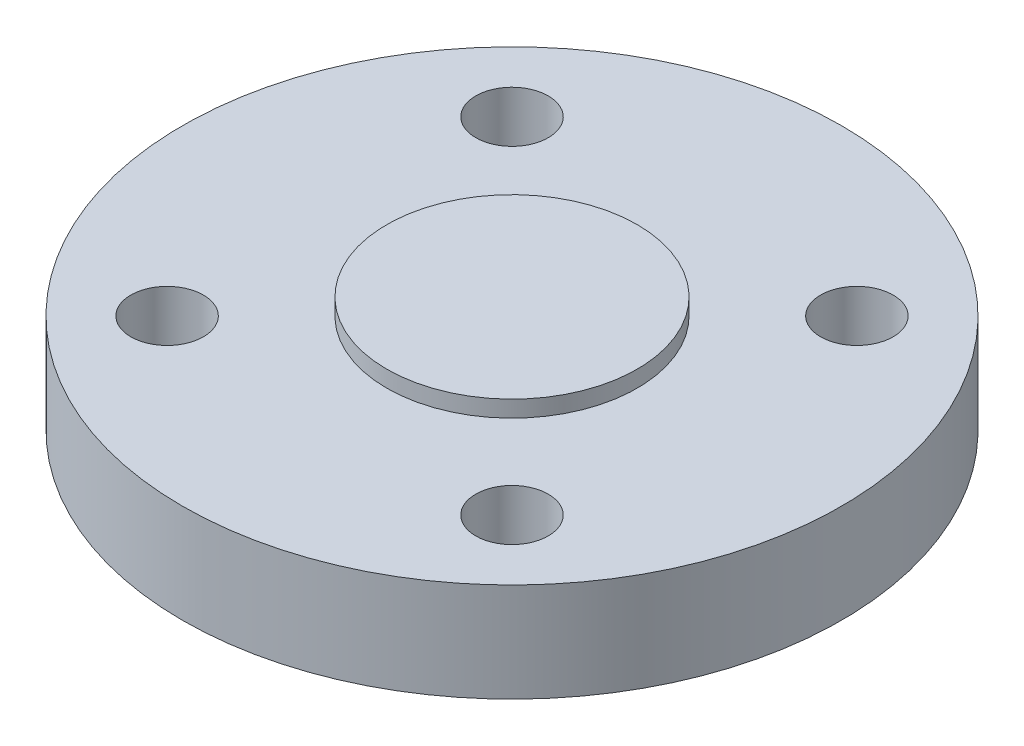
ISO-10303-21;
HEADER;
FILE_DESCRIPTION(('STEP AP214'),'2;1');
FILE_NAME('part.step','',(''),(''),'','','');
FILE_SCHEMA(('AUTOMOTIVE_DESIGN { 1 0 10303 214 1 1 1 1 }'));
ENDSEC;
DATA;
#1=APPLICATION_CONTEXT('core data for automotive mechanical design processes');
#2=APPLICATION_PROTOCOL_DEFINITION('international standard','automotive_design',2000,#1);
#3=PRODUCT_CONTEXT('',#1,'mechanical');
#4=PRODUCT('Part','Part','',(#3));
#5=PRODUCT_RELATED_PRODUCT_CATEGORY('part','',(#4));
#6=PRODUCT_DEFINITION_FORMATION('','',#4);
#7=PRODUCT_DEFINITION_CONTEXT('part definition',#1,'design');
#8=PRODUCT_DEFINITION('design','',#6,#7);
#9=PRODUCT_DEFINITION_SHAPE('','',#8);
#10=(LENGTH_UNIT() NAMED_UNIT(*) SI_UNIT(.MILLI.,.METRE.));
#11=(NAMED_UNIT(*) PLANE_ANGLE_UNIT() SI_UNIT($,.RADIAN.));
#12=(NAMED_UNIT(*) SI_UNIT($,.STERADIAN.) SOLID_ANGLE_UNIT());
#13=UNCERTAINTY_MEASURE_WITH_UNIT(LENGTH_MEASURE(1.E-05),#10,'distance_accuracy_value','');
#14=(GEOMETRIC_REPRESENTATION_CONTEXT(3) GLOBAL_UNCERTAINTY_ASSIGNED_CONTEXT((#13)) GLOBAL_UNIT_ASSIGNED_CONTEXT((#10,
#11,#12)) REPRESENTATION_CONTEXT('',''));
#15=CARTESIAN_POINT('',(0.,0.,0.));
#16=DIRECTION('',(0.,0.,1.));
#17=DIRECTION('',(1.,0.,0.));
#18=AXIS2_PLACEMENT_3D('',#15,#16,#17);
#19=CARTESIAN_POINT('',(0.,15.,0.));
#20=DIRECTION('',(0.,-1.,0.));
#21=DIRECTION('',(0.,0.,-1.));
#22=AXIS2_PLACEMENT_3D('',#19,#20,#21);
#23=CYLINDRICAL_SURFACE('',#22,50.);
#24=CARTESIAN_POINT('',(0.,15.,0.));
#25=DIRECTION('',(0.,1.,0.));
#26=DIRECTION('',(0.,0.,1.));
#27=AXIS2_PLACEMENT_3D('',#24,#25,#26);
#28=CIRCLE('',#27,50.);
#29=CARTESIAN_POINT('',(0.,15.,50.));
#30=VERTEX_POINT('',#29);
#31=EDGE_CURVE('E45',#30,#30,#28,.T.);
#32=ORIENTED_EDGE('',*,*,#31,.F.);
#33=EDGE_LOOP('',(#32));
#34=FACE_BOUND('',#33,.T.);
#35=CARTESIAN_POINT('',(0.,0.,0.));
#36=DIRECTION('',(0.,1.,0.));
#37=DIRECTION('',(0.,0.,1.));
#38=AXIS2_PLACEMENT_3D('',#35,#36,#37);
#39=CIRCLE('',#38,50.);
#40=CARTESIAN_POINT('',(0.,0.,50.));
#41=VERTEX_POINT('',#40);
#42=EDGE_CURVE('E40',#41,#41,#39,.T.);
#43=ORIENTED_EDGE('',*,*,#42,.T.);
#44=EDGE_LOOP('',(#43));
#45=FACE_BOUND('',#44,.T.);
#46=ADVANCED_FACE('F37',(#34,#45),#23,.T.);
#47=CARTESIAN_POINT('',(0.,15.,0.));
#48=DIRECTION('',(0.,1.,0.));
#49=DIRECTION('',(0.,0.,1.));
#50=AXIS2_PLACEMENT_3D('',#47,#48,#49);
#51=PLANE('',#50);
#52=CARTESIAN_POINT('',(-26.1629509039018,15.,-26.1629509039027));
#53=DIRECTION('',(0.,1.,0.));
#54=DIRECTION('',(0.,0.,1.));
#55=AXIS2_PLACEMENT_3D('',#52,#53,#54);
#56=CIRCLE('',#55,5.5);
#57=CARTESIAN_POINT('',(-26.1629509039018,15.,-20.6629509039027));
#58=VERTEX_POINT('',#57);
#59=EDGE_CURVE('E56',#58,#58,#56,.T.);
#60=ORIENTED_EDGE('',*,*,#59,.F.);
#61=EDGE_LOOP('',(#60));
#62=FACE_BOUND('',#61,.T.);
#63=CARTESIAN_POINT('',(26.162950903902,15.,26.1629509039025));
#64=DIRECTION('',(0.,1.,0.));
#65=DIRECTION('',(0.,0.,1.));
#66=AXIS2_PLACEMENT_3D('',#63,#64,#65);
#67=CIRCLE('',#66,5.50000000000001);
#68=CARTESIAN_POINT('',(26.162950903902,15.,31.6629509039025));
#69=VERTEX_POINT('',#68);
#70=EDGE_CURVE('E60',#69,#69,#67,.T.);
#71=ORIENTED_EDGE('',*,*,#70,.F.);
#72=EDGE_LOOP('',(#71));
#73=FACE_BOUND('',#72,.T.);
#74=CARTESIAN_POINT('',(-26.1629509039024,15.,26.1629509039021));
#75=DIRECTION('',(0.,1.,0.));
#76=DIRECTION('',(0.,0.,1.));
#77=AXIS2_PLACEMENT_3D('',#74,#75,#76);
#78=CIRCLE('',#77,5.50000000000012);
#79=CARTESIAN_POINT('',(-26.1629509039024,15.,31.6629509039022));
#80=VERTEX_POINT('',#79);
#81=EDGE_CURVE('E64',#80,#80,#78,.T.);
#82=ORIENTED_EDGE('',*,*,#81,.F.);
#83=EDGE_LOOP('',(#82));
#84=FACE_BOUND('',#83,.T.);
#85=CARTESIAN_POINT('',(26.1629509039024,15.,-26.1629509039021));
#86=DIRECTION('',(0.,1.,0.));
#87=DIRECTION('',(0.,0.,1.));
#88=AXIS2_PLACEMENT_3D('',#85,#86,#87);
#89=CIRCLE('',#88,5.5);
#90=CARTESIAN_POINT('',(26.1629509039024,15.,-20.6629509039021));
#91=VERTEX_POINT('',#90);
#92=EDGE_CURVE('E68',#91,#91,#89,.T.);
#93=ORIENTED_EDGE('',*,*,#92,.F.);
#94=EDGE_LOOP('',(#93));
#95=FACE_BOUND('',#94,.T.);
#96=CARTESIAN_POINT('',(0.,15.,0.));
#97=DIRECTION('',(0.,1.,0.));
#98=DIRECTION('',(0.,0.,1.));
#99=AXIS2_PLACEMENT_3D('',#96,#97,#98);
#100=CIRCLE('',#99,19.);
#101=CARTESIAN_POINT('',(0.,15.,19.));
#102=VERTEX_POINT('',#101);
#103=EDGE_CURVE('E10',#102,#102,#100,.T.);
#104=ORIENTED_EDGE('',*,*,#103,.F.);
#105=EDGE_LOOP('',(#104));
#106=FACE_BOUND('',#105,.T.);
#107=ORIENTED_EDGE('',*,*,#31,.T.);
#108=EDGE_LOOP('',(#107));
#109=FACE_BOUND('',#108,.T.);
#110=ADVANCED_FACE('F109',(#62,#73,#84,#95,#106,#109),#51,.T.);
#111=CARTESIAN_POINT('',(0.,0.,0.));
#112=DIRECTION('',(0.,1.,0.));
#113=DIRECTION('',(0.,0.,1.));
#114=AXIS2_PLACEMENT_3D('',#111,#112,#113);
#115=PLANE('',#114);
#116=CARTESIAN_POINT('',(-26.1629509039018,0.,-26.1629509039027));
#117=DIRECTION('',(0.,1.,0.));
#118=DIRECTION('',(0.,0.,1.));
#119=AXIS2_PLACEMENT_3D('',#116,#117,#118);
#120=CIRCLE('',#119,5.5);
#121=CARTESIAN_POINT('',(-26.1629509039018,0.,-20.6629509039027));
#122=VERTEX_POINT('',#121);
#123=EDGE_CURVE('E77',#122,#122,#120,.T.);
#124=ORIENTED_EDGE('',*,*,#123,.T.);
#125=EDGE_LOOP('',(#124));
#126=FACE_BOUND('',#125,.T.);
#127=CARTESIAN_POINT('',(26.162950903902,0.,26.1629509039025));
#128=DIRECTION('',(0.,1.,0.));
#129=DIRECTION('',(0.,0.,1.));
#130=AXIS2_PLACEMENT_3D('',#127,#128,#129);
#131=CIRCLE('',#130,5.50000000000001);
#132=CARTESIAN_POINT('',(26.162950903902,0.,31.6629509039025));
#133=VERTEX_POINT('',#132);
#134=EDGE_CURVE('E81',#133,#133,#131,.T.);
#135=ORIENTED_EDGE('',*,*,#134,.T.);
#136=EDGE_LOOP('',(#135));
#137=FACE_BOUND('',#136,.T.);
#138=CARTESIAN_POINT('',(-26.1629509039024,0.,26.1629509039021));
#139=DIRECTION('',(0.,1.,0.));
#140=DIRECTION('',(0.,0.,1.));
#141=AXIS2_PLACEMENT_3D('',#138,#139,#140);
#142=CIRCLE('',#141,5.50000000000012);
#143=CARTESIAN_POINT('',(-26.1629509039024,0.,31.6629509039022));
#144=VERTEX_POINT('',#143);
#145=EDGE_CURVE('E76',#144,#144,#142,.T.);
#146=ORIENTED_EDGE('',*,*,#145,.T.);
#147=EDGE_LOOP('',(#146));
#148=FACE_BOUND('',#147,.T.);
#149=CARTESIAN_POINT('',(26.1629509039024,0.,-26.1629509039021));
#150=DIRECTION('',(0.,1.,0.));
#151=DIRECTION('',(0.,0.,1.));
#152=AXIS2_PLACEMENT_3D('',#149,#150,#151);
#153=CIRCLE('',#152,5.5);
#154=CARTESIAN_POINT('',(26.1629509039024,0.,-20.6629509039021));
#155=VERTEX_POINT('',#154);
#156=EDGE_CURVE('E72',#155,#155,#153,.T.);
#157=ORIENTED_EDGE('',*,*,#156,.T.);
#158=EDGE_LOOP('',(#157));
#159=FACE_BOUND('',#158,.T.);
#160=ORIENTED_EDGE('',*,*,#42,.F.);
#161=EDGE_LOOP('',(#160));
#162=FACE_BOUND('',#161,.T.);
#163=ADVANCED_FACE('F89',(#126,#137,#148,#159,#162),#115,.F.);
#164=CARTESIAN_POINT('',(0.,17.5,0.));
#165=DIRECTION('',(0.,-1.,0.));
#166=DIRECTION('',(0.,0.,-1.));
#167=AXIS2_PLACEMENT_3D('',#164,#165,#166);
#168=CYLINDRICAL_SURFACE('',#167,19.);
#169=CARTESIAN_POINT('',(0.,17.5,0.));
#170=DIRECTION('',(0.,1.,0.));
#171=DIRECTION('',(0.,0.,1.));
#172=AXIS2_PLACEMENT_3D('',#169,#170,#171);
#173=CIRCLE('',#172,19.);
#174=CARTESIAN_POINT('',(0.,17.5,19.));
#175=VERTEX_POINT('',#174);
#176=EDGE_CURVE('E52',#175,#175,#173,.T.);
#177=ORIENTED_EDGE('',*,*,#176,.F.);
#178=EDGE_LOOP('',(#177));
#179=FACE_BOUND('',#178,.T.);
#180=ORIENTED_EDGE('',*,*,#103,.T.);
#181=EDGE_LOOP('',(#180));
#182=FACE_BOUND('',#181,.T.);
#183=ADVANCED_FACE('F123',(#179,#182),#168,.T.);
#184=CARTESIAN_POINT('',(0.,17.5,0.));
#185=DIRECTION('',(0.,1.,0.));
#186=DIRECTION('',(0.,0.,1.));
#187=AXIS2_PLACEMENT_3D('',#184,#185,#186);
#188=PLANE('',#187);
#189=ORIENTED_EDGE('',*,*,#176,.T.);
#190=EDGE_LOOP('',(#189));
#191=FACE_BOUND('',#190,.T.);
#192=ADVANCED_FACE('F105',(#191),#188,.T.);
#193=CARTESIAN_POINT('',(26.1629509039024,0.,-26.1629509039021));
#194=DIRECTION('',(0.,1.,0.));
#195=DIRECTION('',(0.,0.,1.));
#196=AXIS2_PLACEMENT_3D('',#193,#194,#195);
#197=CYLINDRICAL_SURFACE('',#196,5.5);
#198=ORIENTED_EDGE('',*,*,#92,.T.);
#199=EDGE_LOOP('',(#198));
#200=FACE_BOUND('',#199,.T.);
#201=ORIENTED_EDGE('',*,*,#156,.F.);
#202=EDGE_LOOP('',(#201));
#203=FACE_BOUND('',#202,.T.);
#204=ADVANCED_FACE('F95',(#200,#203),#197,.F.);
#205=CARTESIAN_POINT('',(-26.1629509039024,0.,26.1629509039021));
#206=DIRECTION('',(0.,1.,0.));
#207=DIRECTION('',(0.,0.,1.));
#208=AXIS2_PLACEMENT_3D('',#205,#206,#207);
#209=CYLINDRICAL_SURFACE('',#208,5.50000000000012);
#210=ORIENTED_EDGE('',*,*,#81,.T.);
#211=EDGE_LOOP('',(#210));
#212=FACE_BOUND('',#211,.T.);
#213=ORIENTED_EDGE('',*,*,#145,.F.);
#214=EDGE_LOOP('',(#213));
#215=FACE_BOUND('',#214,.T.);
#216=ADVANCED_FACE('F92',(#212,#215),#209,.F.);
#217=CARTESIAN_POINT('',(26.162950903902,0.,26.1629509039025));
#218=DIRECTION('',(0.,1.,0.));
#219=DIRECTION('',(0.,0.,1.));
#220=AXIS2_PLACEMENT_3D('',#217,#218,#219);
#221=CYLINDRICAL_SURFACE('',#220,5.50000000000001);
#222=ORIENTED_EDGE('',*,*,#70,.T.);
#223=EDGE_LOOP('',(#222));
#224=FACE_BOUND('',#223,.T.);
#225=ORIENTED_EDGE('',*,*,#134,.F.);
#226=EDGE_LOOP('',(#225));
#227=FACE_BOUND('',#226,.T.);
#228=ADVANCED_FACE('F94',(#224,#227),#221,.F.);
#229=CARTESIAN_POINT('',(-26.1629509039018,0.,-26.1629509039027));
#230=DIRECTION('',(0.,1.,0.));
#231=DIRECTION('',(0.,0.,1.));
#232=AXIS2_PLACEMENT_3D('',#229,#230,#231);
#233=CYLINDRICAL_SURFACE('',#232,5.5);
#234=ORIENTED_EDGE('',*,*,#59,.T.);
#235=EDGE_LOOP('',(#234));
#236=FACE_BOUND('',#235,.T.);
#237=ORIENTED_EDGE('',*,*,#123,.F.);
#238=EDGE_LOOP('',(#237));
#239=FACE_BOUND('',#238,.T.);
#240=ADVANCED_FACE('F102',(#236,#239),#233,.F.);
#241=CLOSED_SHELL('',(#46,#110,#163,#183,#192,#204,#216,#228,#240));
#242=MANIFOLD_SOLID_BREP('B2',#241);
#243=ADVANCED_BREP_SHAPE_REPRESENTATION('',(#18,#242),#14);
#244=SHAPE_DEFINITION_REPRESENTATION(#9,#243);
ENDSEC;
END-ISO-10303-21;
